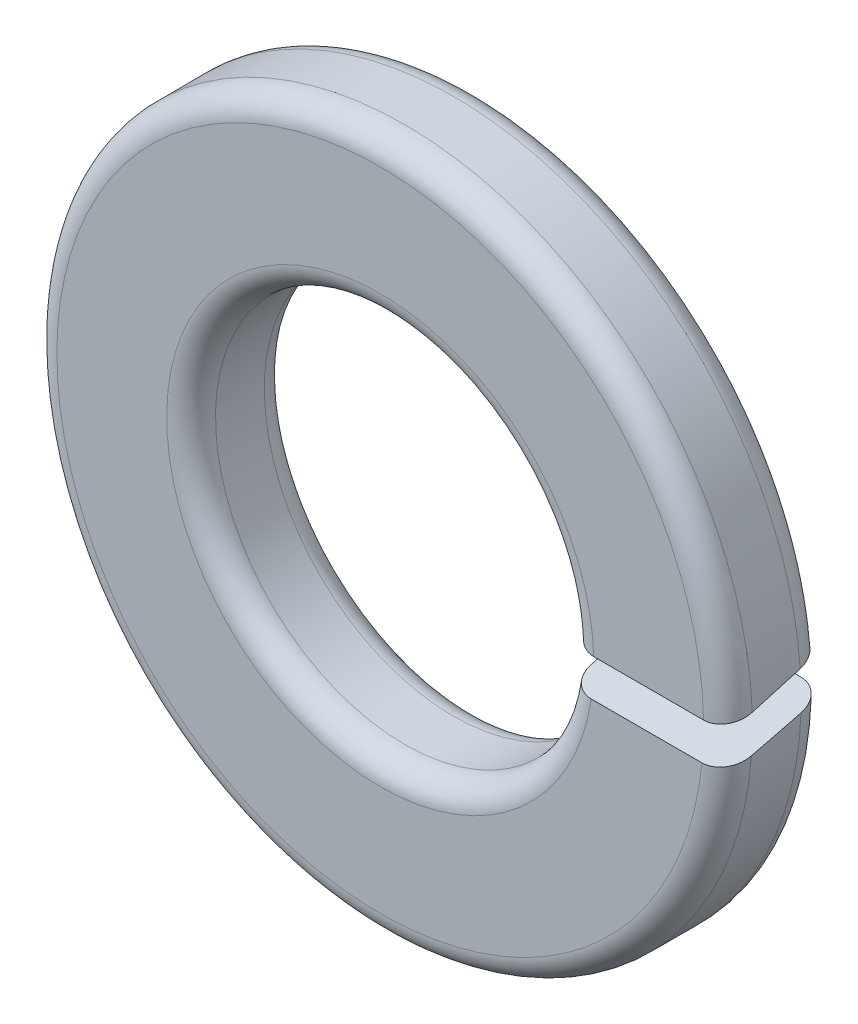
ISO-10303-21;
HEADER;
FILE_DESCRIPTION(('STEP AP214'),'2;1');
FILE_NAME('part.step','',(''),(''),'','','');
FILE_SCHEMA(('AUTOMOTIVE_DESIGN { 1 0 10303 214 1 1 1 1 }'));
ENDSEC;
DATA;
#1=APPLICATION_CONTEXT('core data for automotive mechanical design processes');
#2=APPLICATION_PROTOCOL_DEFINITION('international standard','automotive_design',2000,#1);
#3=PRODUCT_CONTEXT('',#1,'mechanical');
#4=PRODUCT('Part','Part','',(#3));
#5=PRODUCT_RELATED_PRODUCT_CATEGORY('part','',(#4));
#6=PRODUCT_DEFINITION_FORMATION('','',#4);
#7=PRODUCT_DEFINITION_CONTEXT('part definition',#1,'design');
#8=PRODUCT_DEFINITION('design','',#6,#7);
#9=PRODUCT_DEFINITION_SHAPE('','',#8);
#10=(LENGTH_UNIT() NAMED_UNIT(*) SI_UNIT(.MILLI.,.METRE.));
#11=(NAMED_UNIT(*) PLANE_ANGLE_UNIT() SI_UNIT($,.RADIAN.));
#12=(NAMED_UNIT(*) SI_UNIT($,.STERADIAN.) SOLID_ANGLE_UNIT());
#13=UNCERTAINTY_MEASURE_WITH_UNIT(LENGTH_MEASURE(1.E-05),#10,'distance_accuracy_value','');
#14=(GEOMETRIC_REPRESENTATION_CONTEXT(3) GLOBAL_UNCERTAINTY_ASSIGNED_CONTEXT((#13)) GLOBAL_UNIT_ASSIGNED_CONTEXT((#10,
#11,#12)) REPRESENTATION_CONTEXT('',''));
#15=CARTESIAN_POINT('',(0.,0.,0.));
#16=DIRECTION('',(0.,0.,1.));
#17=DIRECTION('',(1.,0.,0.));
#18=AXIS2_PLACEMENT_3D('',#15,#16,#17);
#19=CARTESIAN_POINT('',(0.,0.,0.8));
#20=DIRECTION('',(0.,0.,1.));
#21=DIRECTION('',(1.,0.,0.));
#22=AXIS2_PLACEMENT_3D('',#19,#20,#21);
#23=PLANE('',#22);
#24=CARTESIAN_POINT('',(0.,0.,0.8));
#25=DIRECTION('',(0.,0.,1.));
#26=DIRECTION('',(1.,0.,0.));
#27=AXIS2_PLACEMENT_3D('',#24,#25,#26);
#28=CIRCLE('',#27,1.75);
#29=CARTESIAN_POINT('',(1.73020487791106,-0.262471104033963,0.8));
#30=VERTEX_POINT('',#29);
#31=CARTESIAN_POINT('',(1.74933852055666,0.0481117500890618,0.8));
#32=VERTEX_POINT('',#31);
#33=EDGE_CURVE('E116',#30,#32,#28,.F.);
#34=ORIENTED_EDGE('',*,*,#33,.T.);
#35=DIRECTION('',(-1.,0.,0.));
#36=VECTOR('',#35,1.);
#37=CARTESIAN_POINT('',(2.85,0.0481117500890618,0.8));
#38=LINE('',#37,#36);
#39=CARTESIAN_POINT('',(2.64956322051454,0.0481117500890618,0.8));
#40=VERTEX_POINT('',#39);
#41=EDGE_CURVE('E199',#40,#32,#38,.T.);
#42=ORIENTED_EDGE('',*,*,#41,.F.);
#43=CARTESIAN_POINT('',(0.,0.,0.8));
#44=DIRECTION('',(0.,0.,1.));
#45=DIRECTION('',(1.,0.,0.));
#46=AXIS2_PLACEMENT_3D('',#43,#44,#45);
#47=CIRCLE('',#46,2.65);
#48=CARTESIAN_POINT('',(2.63696964706661,-0.262471104033963,0.8));
#49=VERTEX_POINT('',#48);
#50=EDGE_CURVE('E121',#40,#49,#47,.T.);
#51=ORIENTED_EDGE('',*,*,#50,.T.);
#52=DIRECTION('',(-1.,0.,0.));
#53=VECTOR('',#52,1.);
#54=CARTESIAN_POINT('',(2.85,-0.262471104033963,0.8));
#55=LINE('',#54,#53);
#56=EDGE_CURVE('E113',#49,#30,#55,.T.);
#57=ORIENTED_EDGE('',*,*,#56,.T.);
#58=EDGE_LOOP('',(#34,#42,#51,#57));
#59=FACE_BOUND('',#58,.T.);
#60=ADVANCED_FACE('F31',(#59),#23,.T.);
#61=CARTESIAN_POINT('',(0.,0.,0.));
#62=DIRECTION('',(0.,0.,1.));
#63=DIRECTION('',(1.,0.,0.));
#64=AXIS2_PLACEMENT_3D('',#61,#62,#63);
#65=PLANE('',#64);
#66=DIRECTION('',(-1.,0.,0.));
#67=VECTOR('',#66,1.);
#68=CARTESIAN_POINT('',(2.85,0.262471104033963,0.));
#69=LINE('',#68,#67);
#70=CARTESIAN_POINT('',(2.63696964706597,0.262471104033963,0.));
#71=VERTEX_POINT('',#70);
#72=CARTESIAN_POINT('',(1.73020487791106,0.262471104033963,0.));
#73=VERTEX_POINT('',#72);
#74=EDGE_CURVE('E59',#71,#73,#69,.T.);
#75=ORIENTED_EDGE('',*,*,#74,.T.);
#76=CARTESIAN_POINT('',(0.,0.,0.));
#77=DIRECTION('',(0.,0.,1.));
#78=DIRECTION('',(1.,0.,0.));
#79=AXIS2_PLACEMENT_3D('',#76,#77,#78);
#80=CIRCLE('',#79,1.75);
#81=CARTESIAN_POINT('',(1.74933852055671,-0.048111750089062,0.));
#82=VERTEX_POINT('',#81);
#83=EDGE_CURVE('E112',#73,#82,#80,.T.);
#84=ORIENTED_EDGE('',*,*,#83,.T.);
#85=DIRECTION('',(-1.,0.,0.));
#86=VECTOR('',#85,1.);
#87=CARTESIAN_POINT('',(2.85,-0.048111750089062,0.));
#88=LINE('',#87,#86);
#89=CARTESIAN_POINT('',(2.64956322051454,-0.048111750089062,0.));
#90=VERTEX_POINT('',#89);
#91=EDGE_CURVE('E99',#90,#82,#88,.T.);
#92=ORIENTED_EDGE('',*,*,#91,.F.);
#93=CARTESIAN_POINT('',(0.,0.,0.));
#94=DIRECTION('',(0.,0.,1.));
#95=DIRECTION('',(1.,0.,0.));
#96=AXIS2_PLACEMENT_3D('',#93,#94,#95);
#97=CIRCLE('',#96,2.65);
#98=EDGE_CURVE('E110',#90,#71,#97,.F.);
#99=ORIENTED_EDGE('',*,*,#98,.T.);
#100=EDGE_LOOP('',(#75,#84,#92,#99));
#101=FACE_BOUND('',#100,.T.);
#102=ADVANCED_FACE('F109',(#101),#65,.F.);
#103=CARTESIAN_POINT('',(0.,0.,0.8));
#104=DIRECTION('',(0.,0.,-1.));
#105=DIRECTION('',(-1.,0.,0.));
#106=AXIS2_PLACEMENT_3D('',#103,#104,#105);
#107=CYLINDRICAL_SURFACE('',#106,2.85);
#108=CARTESIAN_POINT('',(0.,0.,0.979555495773432));
#109=DIRECTION('',(0.,-0.965925826289067,-0.258819045102525));
#110=DIRECTION('',(0.,0.258819045102525,-0.965925826289067));
#111=AXIS2_PLACEMENT_3D('',#108,#109,#110);
#112=ELLIPSE('',#111,11.0115544196952,2.85);
#113=CARTESIAN_POINT('',(2.84233506415116,0.208881265547738,0.200000000000001));
#114=VERTEX_POINT('',#113);
#115=CARTESIAN_POINT('',(2.84818482316041,0.101701588575287,0.6));
#116=VERTEX_POINT('',#115);
#117=EDGE_CURVE('E215',#114,#116,#112,.T.);
#118=ORIENTED_EDGE('',*,*,#117,.F.);
#119=CARTESIAN_POINT('',(0.,0.,0.2));
#120=DIRECTION('',(0.,0.,1.));
#121=DIRECTION('',(1.,0.,0.));
#122=AXIS2_PLACEMENT_3D('',#119,#120,#121);
#123=CIRCLE('',#122,2.85);
#124=CARTESIAN_POINT('',(2.84818482316041,-0.101701588575287,0.2));
#125=VERTEX_POINT('',#124);
#126=EDGE_CURVE('E118',#114,#125,#123,.T.);
#127=ORIENTED_EDGE('',*,*,#126,.T.);
#128=CARTESIAN_POINT('',(0.,0.,-0.179555495773433));
#129=DIRECTION('',(0.,0.965925826289067,0.258819045102525));
#130=DIRECTION('',(0.,0.258819045102525,-0.965925826289067));
#131=AXIS2_PLACEMENT_3D('',#128,#129,#130);
#132=ELLIPSE('',#131,11.0115544196952,2.85);
#133=CARTESIAN_POINT('',(2.84233506415116,-0.208881265547738,0.6));
#134=VERTEX_POINT('',#133);
#135=EDGE_CURVE('E51',#134,#125,#132,.T.);
#136=ORIENTED_EDGE('',*,*,#135,.F.);
#137=CARTESIAN_POINT('',(0.,0.,0.6));
#138=DIRECTION('',(0.,0.,1.));
#139=DIRECTION('',(1.,0.,0.));
#140=AXIS2_PLACEMENT_3D('',#137,#138,#139);
#141=CIRCLE('',#140,2.85);
#142=EDGE_CURVE('E105',#134,#116,#141,.F.);
#143=ORIENTED_EDGE('',*,*,#142,.T.);
#144=EDGE_LOOP('',(#118,#127,#136,#143));
#145=FACE_BOUND('',#144,.T.);
#146=ADVANCED_FACE('F33',(#145),#107,.T.);
#147=CARTESIAN_POINT('',(0.,0.,0.8));
#148=DIRECTION('',(0.,0.,-1.));
#149=DIRECTION('',(-1.,0.,0.));
#150=AXIS2_PLACEMENT_3D('',#147,#148,#149);
#151=CYLINDRICAL_SURFACE('',#150,1.55);
#152=CARTESIAN_POINT('',(0.,0.,0.2));
#153=DIRECTION('',(0.,0.,1.));
#154=DIRECTION('',(1.,0.,0.));
#155=AXIS2_PLACEMENT_3D('',#152,#153,#154);
#156=CIRCLE('',#155,1.55);
#157=CARTESIAN_POINT('',(1.54665988080161,-0.101701588575288,0.200000000000001));
#158=VERTEX_POINT('',#157);
#159=CARTESIAN_POINT('',(1.53586087159716,0.208881265547739,0.199999999999998));
#160=VERTEX_POINT('',#159);
#161=EDGE_CURVE('E188',#158,#160,#156,.F.);
#162=ORIENTED_EDGE('',*,*,#161,.T.);
#163=CARTESIAN_POINT('',(0.,0.,0.979555495773432));
#164=DIRECTION('',(0.,-0.965925826289067,-0.258819045102525));
#165=DIRECTION('',(0.,0.258819045102525,-0.965925826289067));
#166=AXIS2_PLACEMENT_3D('',#163,#164,#165);
#167=ELLIPSE('',#166,5.98874012299213,1.55);
#168=CARTESIAN_POINT('',(1.54665988080161,0.101701588575287,0.6));
#169=VERTEX_POINT('',#168);
#170=EDGE_CURVE('E174',#160,#169,#167,.T.);
#171=ORIENTED_EDGE('',*,*,#170,.T.);
#172=CARTESIAN_POINT('',(0.,0.,0.6));
#173=DIRECTION('',(0.,0.,1.));
#174=DIRECTION('',(1.,0.,0.));
#175=AXIS2_PLACEMENT_3D('',#172,#173,#174);
#176=CIRCLE('',#175,1.55);
#177=CARTESIAN_POINT('',(1.53586087159716,-0.208881265547738,0.6));
#178=VERTEX_POINT('',#177);
#179=EDGE_CURVE('E191',#169,#178,#176,.T.);
#180=ORIENTED_EDGE('',*,*,#179,.T.);
#181=CARTESIAN_POINT('',(0.,0.,-0.179555495773433));
#182=DIRECTION('',(0.,0.965925826289067,0.258819045102525));
#183=DIRECTION('',(0.,0.258819045102525,-0.965925826289067));
#184=AXIS2_PLACEMENT_3D('',#181,#182,#183);
#185=ELLIPSE('',#184,5.98874012299213,1.55);
#186=EDGE_CURVE('E154',#178,#158,#185,.T.);
#187=ORIENTED_EDGE('',*,*,#186,.T.);
#188=EDGE_LOOP('',(#162,#171,#180,#187));
#189=FACE_BOUND('',#188,.T.);
#190=ADVANCED_FACE('F213',(#189),#151,.F.);
#191=CARTESIAN_POINT('',(0.,0.,0.6));
#192=DIRECTION('',(0.,0.,1.));
#193=DIRECTION('',(1.,0.,0.));
#194=AXIS2_PLACEMENT_3D('',#191,#192,#193);
#195=TOROIDAL_SURFACE('',#194,1.75,0.2);
#196=ORIENTED_EDGE('',*,*,#179,.F.);
#197=CARTESIAN_POINT('',(1.54665645625202,0.101755178413774,0.5998));
#198=CARTESIAN_POINT('',(1.54684499566643,0.0986061826476783,0.611552212191886));
#199=CARTESIAN_POINT('',(1.54807492349918,0.0954622493659219,0.623285530935008));
#200=CARTESIAN_POINT('',(1.55254223075983,0.0892709113297575,0.646391919052807));
#201=CARTESIAN_POINT('',(1.55577986364626,0.0862235188139993,0.657764942752221));
#202=CARTESIAN_POINT('',(1.56418946852833,0.0803108889003449,0.67983117799633));
#203=CARTESIAN_POINT('',(1.56936249723886,0.0774457520146896,0.690524014424235));
#204=CARTESIAN_POINT('',(1.58151352875446,0.0719853183279291,0.710902630374586));
#205=CARTESIAN_POINT('',(1.58849084802892,0.0693899198609996,0.720588789319053));
#206=CARTESIAN_POINT('',(1.60398127948817,0.0645803412919593,0.738538380901706));
#207=CARTESIAN_POINT('',(1.61247444093145,0.0623618639528783,0.746817851046596));
#208=CARTESIAN_POINT('',(1.63083231324646,0.0583425153475336,0.761818264255073));
#209=CARTESIAN_POINT('',(1.64069715004196,0.0565416824627778,0.768539064076923));
#210=CARTESIAN_POINT('',(1.66111730525023,0.0534837049987454,0.779951591341092));
#211=CARTESIAN_POINT('',(1.67163258919453,0.0522086278487169,0.784710244048568));
#212=CARTESIAN_POINT('',(1.69335806399738,0.0501558961195537,0.792371143156114));
#213=CARTESIAN_POINT('',(1.7045673148634,0.0493775841609281,0.795275842929843));
#214=CARTESIAN_POINT('',(1.72160018160645,0.048606449508953,0.798153756630491));
#215=CARTESIAN_POINT('',(1.72729917371314,0.0484154468203551,0.798866588368721));
#216=CARTESIAN_POINT('',(1.73873148323704,0.0481651295275354,0.799800785223537));
#217=CARTESIAN_POINT('',(1.74446473585614,0.0481056165795094,0.800022890569278));
#218=CARTESIAN_POINT('',(1.75019999999999,0.048112246875637,0.799998145967261));
#219=B_SPLINE_CURVE_WITH_KNOTS('',3,(#197,#198,#199,#200,#201,#202,#203,#204,#205,#206,#207,
#208,#209,#210,#211,#212,#213,#214,#215,#216,#217,#218),.UNSPECIFIED.,.F.,.F.,(4,2,2,2,2,2,2,2,
2,2,4),(0.,0.0364573751008911,0.07291935362416,0.109401269298186,0.145869384496923,
0.181888837435626,0.217911599250003,0.252576742057746,0.28719591614266,0.304416014983086,
0.321610120628355),.UNSPECIFIED.);
#220=EDGE_CURVE('E182',#169,#32,#219,.T.);
#221=ORIENTED_EDGE('',*,*,#220,.T.);
#222=ORIENTED_EDGE('',*,*,#33,.F.);
#223=CARTESIAN_POINT('',(1.7502,-0.262209630622204,0.799024167942485));
#224=CARTESIAN_POINT('',(1.73930912738885,-0.262497359867144,0.800097988103423));
#225=CARTESIAN_POINT('',(1.72832277992004,-0.262548348695288,0.800288281000677));
#226=CARTESIAN_POINT('',(1.70646825563088,-0.262178245406867,0.79890703672424));
#227=CARTESIAN_POINT('',(1.69560009610959,-0.261757085096831,0.797335245049057));
#228=CARTESIAN_POINT('',(1.67428105541743,-0.260443179044081,0.792431680903819));
#229=CARTESIAN_POINT('',(1.66383071376601,-0.259549843482496,0.789097707199778));
#230=CARTESIAN_POINT('',(1.64368031636129,-0.257314142736716,0.780753958426006));
#231=CARTESIAN_POINT('',(1.63397981733064,-0.255972045381131,0.77574518290626));
#232=CARTESIAN_POINT('',(1.61576737971209,-0.252903383987461,0.764292782673857));
#233=CARTESIAN_POINT('',(1.60723815410089,-0.251183686232782,0.757874783279733));
#234=CARTESIAN_POINT('',(1.59141384482392,-0.247398438190675,0.74374804526734));
#235=CARTESIAN_POINT('',(1.58411893507146,-0.245332839247718,0.736039125064166));
#236=CARTESIAN_POINT('',(1.57093813553797,-0.240914037899366,0.719547933923559));
#237=CARTESIAN_POINT('',(1.56505491897963,-0.238560302395835,0.710763673436806));
#238=CARTESIAN_POINT('',(1.55484164516691,-0.233636116411414,0.692386361157026));
#239=CARTESIAN_POINT('',(1.55051235615359,-0.231065559510338,0.682792912198467));
#240=CARTESIAN_POINT('',(1.54336519692944,-0.225690888080951,0.662734365350005));
#241=CARTESIAN_POINT('',(1.54060316484177,-0.222881822465327,0.652250789750699));
#242=CARTESIAN_POINT('',(1.53685213300574,-0.217189679781391,0.631007424050321));
#243=CARTESIAN_POINT('',(1.53586011742553,-0.214306737108492,0.620248135519755));
#244=CARTESIAN_POINT('',(1.53570431282245,-0.210558415561585,0.606259209063591));
#245=CARTESIAN_POINT('',(1.53574705069404,-0.209692476550421,0.603027480677671));
#246=CARTESIAN_POINT('',(1.5358682599292,-0.208827675709252,0.5998));
#247=B_SPLINE_CURVE_WITH_KNOTS('',3,(#223,#224,#225,#226,#227,#228,#229,#230,#231,#232,#233,
#234,#235,#236,#237,#238,#239,#240,#241,#242,#243,#244,#245,#246),.UNSPECIFIED.,.F.,.F.,(4,2,2,
2,2,2,2,2,2,2,2,4),(0.,0.0328090665009481,0.0656228722932912,0.0984777647417578,0.1313130837309,
0.163594595146905,0.195880651200048,0.22822737091997,0.260590060471673,0.294043131792411,
0.327439149674152,0.337472976972827),.UNSPECIFIED.);
#248=EDGE_CURVE('E210',#30,#178,#247,.T.);
#249=ORIENTED_EDGE('',*,*,#248,.T.);
#250=EDGE_LOOP('',(#196,#221,#222,#249));
#251=FACE_BOUND('',#250,.T.);
#252=ADVANCED_FACE('F160',(#251),#195,.T.);
#253=CARTESIAN_POINT('',(0.,0.,0.2));
#254=DIRECTION('',(0.,0.,1.));
#255=DIRECTION('',(1.,0.,0.));
#256=AXIS2_PLACEMENT_3D('',#253,#254,#255);
#257=TOROIDAL_SURFACE('',#256,1.75,0.2);
#258=ORIENTED_EDGE('',*,*,#83,.F.);
#259=CARTESIAN_POINT('',(1.7502,0.262209630622204,0.000975832057514856));
#260=CARTESIAN_POINT('',(1.73930912738885,0.262497359867144,-9.79881034228843E-05));
#261=CARTESIAN_POINT('',(1.72832277992004,0.262548348695288,-0.000288281000676921));
#262=CARTESIAN_POINT('',(1.70646825563088,0.262178245406867,0.0010929632757601));
#263=CARTESIAN_POINT('',(1.69560009610959,0.261757085096831,0.00266475495094293));
#264=CARTESIAN_POINT('',(1.67428105541743,0.260443179044081,0.00756831909618054));
#265=CARTESIAN_POINT('',(1.66383071376601,0.259549843482496,0.010902292800222));
#266=CARTESIAN_POINT('',(1.64368031636129,0.257314142736716,0.0192460415739943));
#267=CARTESIAN_POINT('',(1.63397981733064,0.255972045381131,0.0242548170937396));
#268=CARTESIAN_POINT('',(1.61576737971209,0.252903383987461,0.035707217326143));
#269=CARTESIAN_POINT('',(1.60723815410089,0.251183686232782,0.0421252167202671));
#270=CARTESIAN_POINT('',(1.59141384482392,0.247398438190675,0.0562519547326605));
#271=CARTESIAN_POINT('',(1.58411893507146,0.245332839247718,0.0639608749358344));
#272=CARTESIAN_POINT('',(1.57093813553797,0.240914037899365,0.0804520660764407));
#273=CARTESIAN_POINT('',(1.56505491897963,0.238560302395835,0.0892363265631942));
#274=CARTESIAN_POINT('',(1.55484164516691,0.233636116411414,0.107613638842974));
#275=CARTESIAN_POINT('',(1.55051235615359,0.231065559510338,0.117207087801533));
#276=CARTESIAN_POINT('',(1.54336519692944,0.225690888080951,0.137265634649996));
#277=CARTESIAN_POINT('',(1.54060316484177,0.222881822465327,0.147749210249301));
#278=CARTESIAN_POINT('',(1.53685213300574,0.217189679781391,0.168992575949679));
#279=CARTESIAN_POINT('',(1.53586011742553,0.214306737108492,0.179751864480245));
#280=CARTESIAN_POINT('',(1.53570431282245,0.210558415561585,0.193740790936409));
#281=CARTESIAN_POINT('',(1.53574705069404,0.209692476550421,0.196972519322329));
#282=CARTESIAN_POINT('',(1.5358682599292,0.208827675709252,0.2002));
#283=B_SPLINE_CURVE_WITH_KNOTS('',3,(#259,#260,#261,#262,#263,#264,#265,#266,#267,#268,#269,
#270,#271,#272,#273,#274,#275,#276,#277,#278,#279,#280,#281,#282),.UNSPECIFIED.,.F.,.F.,(4,2,2,
2,2,2,2,2,2,2,2,4),(0.,0.0328090665009481,0.0656228722932912,0.0984777647417578,0.1313130837309,
0.163594595146905,0.195880651200048,0.22822737091997,0.260590060471673,0.294043131792411,
0.327439149674152,0.337472976972827),.UNSPECIFIED.);
#284=EDGE_CURVE('E167',#73,#160,#283,.T.);
#285=ORIENTED_EDGE('',*,*,#284,.T.);
#286=ORIENTED_EDGE('',*,*,#161,.F.);
#287=CARTESIAN_POINT('',(1.54665645625202,-0.101755178413774,0.2002));
#288=CARTESIAN_POINT('',(1.54684499566643,-0.0986061826476785,0.188447787808114));
#289=CARTESIAN_POINT('',(1.54807492349918,-0.0954622493659221,0.176714469064992));
#290=CARTESIAN_POINT('',(1.55254223075982,-0.0892709113297577,0.153608080947193));
#291=CARTESIAN_POINT('',(1.55577986364626,-0.0862235188139995,0.142235057247779));
#292=CARTESIAN_POINT('',(1.56418946852833,-0.0803108889003451,0.12016882200367));
#293=CARTESIAN_POINT('',(1.56936249723886,-0.0774457520146899,0.109475985575765));
#294=CARTESIAN_POINT('',(1.58151352875446,-0.0719853183279293,0.089097369625414));
#295=CARTESIAN_POINT('',(1.58849084802892,-0.0693899198609998,0.0794112106809468));
#296=CARTESIAN_POINT('',(1.60398127948817,-0.0645803412919595,0.0614616190982943));
#297=CARTESIAN_POINT('',(1.61247444093145,-0.0623618639528785,0.053182148953404));
#298=CARTESIAN_POINT('',(1.63083231324646,-0.0583425153475339,0.0381817357449269));
#299=CARTESIAN_POINT('',(1.64069715004196,-0.056541682462778,0.0314609359230774));
#300=CARTESIAN_POINT('',(1.66111730525023,-0.0534837049987457,0.0200484086589082));
#301=CARTESIAN_POINT('',(1.67163258919453,-0.0522086278487172,0.0152897559514317));
#302=CARTESIAN_POINT('',(1.69335806399738,-0.0501558961195539,0.00762885684388569));
#303=CARTESIAN_POINT('',(1.7045673148634,-0.0493775841609283,0.00472415707015659));
#304=CARTESIAN_POINT('',(1.72160018160645,-0.0486064495089533,0.0018462433695089));
#305=CARTESIAN_POINT('',(1.72729917371314,-0.0484154468203553,0.00113341163127916));
#306=CARTESIAN_POINT('',(1.73873148323704,-0.0481651295275356,0.000199214776463041));
#307=CARTESIAN_POINT('',(1.74446473585614,-0.0481056165795097,-2.28905692781266E-05));
#308=CARTESIAN_POINT('',(1.75019999999999,-0.0481122468756372,1.85403273901141E-06));
#309=B_SPLINE_CURVE_WITH_KNOTS('',3,(#287,#288,#289,#290,#291,#292,#293,#294,#295,#296,#297,
#298,#299,#300,#301,#302,#303,#304,#305,#306,#307,#308),.UNSPECIFIED.,.F.,.F.,(4,2,2,2,2,2,2,2,
2,2,4),(0.,0.036457375100891,0.0729193536241599,0.109401269298186,0.145869384496923,
0.181888837435626,0.217911599250003,0.252576742057746,0.28719591614266,0.304416014983086,
0.321610120628355),.UNSPECIFIED.);
#310=EDGE_CURVE('E148',#158,#82,#309,.T.);
#311=ORIENTED_EDGE('',*,*,#310,.T.);
#312=EDGE_LOOP('',(#258,#285,#286,#311));
#313=FACE_BOUND('',#312,.T.);
#314=ADVANCED_FACE('F155',(#313),#257,.T.);
#315=CARTESIAN_POINT('',(0.,0.,0.6));
#316=DIRECTION('',(0.,0.,1.));
#317=DIRECTION('',(1.,0.,0.));
#318=AXIS2_PLACEMENT_3D('',#315,#316,#317);
#319=TOROIDAL_SURFACE('',#318,2.65,0.2);
#320=ORIENTED_EDGE('',*,*,#50,.F.);
#321=CARTESIAN_POINT('',(2.44788610308285,0.101755178413773,0.5998));
#322=CARTESIAN_POINT('',(2.44799710646355,0.0986262733096464,0.611477232820663));
#323=CARTESIAN_POINT('',(2.4491398621911,0.0955004657682211,0.623142905379945));
#324=CARTESIAN_POINT('',(2.45342099939149,0.0893409667886329,0.646130468520936));
#325=CARTESIAN_POINT('',(2.45655984391043,0.0863072968953915,0.657452278695905));
#326=CARTESIAN_POINT('',(2.46476778098678,0.0804176496039478,0.679432741626233));
#327=CARTESIAN_POINT('',(2.46983810312454,0.0775617867480465,0.690090966903905));
#328=CARTESIAN_POINT('',(2.48178255046155,0.0721160159491853,0.710414860211629));
#329=CARTESIAN_POINT('',(2.48865592157826,0.0695259974516677,0.720080940836908));
#330=CARTESIAN_POINT('',(2.50392609390901,0.064727297385739,0.737989933293238));
#331=CARTESIAN_POINT('',(2.51230006891167,0.0625137575956651,0.746250976254369));
#332=CARTESIAN_POINT('',(2.53041386829479,0.0584982805986888,0.761236940423708));
#333=CARTESIAN_POINT('',(2.54015364089157,0.0566963277934316,0.767961919845769));
#334=CARTESIAN_POINT('',(2.56034363470766,0.0536264406894453,0.779418894491347));
#335=CARTESIAN_POINT('',(2.5707552426637,0.0523414987851043,0.784214362963121));
#336=CARTESIAN_POINT('',(2.59228433150369,0.0502614729777455,0.791977124957239));
#337=CARTESIAN_POINT('',(2.60340160941541,0.0494662489148863,0.79494494156323));
#338=CARTESIAN_POINT('',(2.6256004814922,0.0484150476208592,0.798868078201522));
#339=CARTESIAN_POINT('',(2.63666924733837,0.0481408752494761,0.799891303421555));
#340=CARTESIAN_POINT('',(2.65882447712111,0.0480870433963813,0.80009220663237));
#341=CARTESIAN_POINT('',(2.66991093899418,0.0483073299448697,0.799270086041188));
#342=CARTESIAN_POINT('',(2.69157619827214,0.0492272614203247,0.795836855035308));
#343=CARTESIAN_POINT('',(2.70216054591738,0.0499181871710368,0.793258285029393));
#344=CARTESIAN_POINT('',(2.72273367720905,0.051748034994134,0.786429199983475));
#345=CARTESIAN_POINT('',(2.73272246164947,0.052886956469252,0.782178687172503));
#346=CARTESIAN_POINT('',(2.75188059065676,0.0555832979228676,0.772115803873056));
#347=CARTESIAN_POINT('',(2.76104565721626,0.0571427513731559,0.766295844364542));
#348=CARTESIAN_POINT('',(2.77826237292203,0.0606294031505501,0.753283482783006));
#349=CARTESIAN_POINT('',(2.78631397786597,0.0625566160697929,0.746091026251389));
#350=CARTESIAN_POINT('',(2.80127476502411,0.066769480648908,0.730368401596725));
#351=CARTESIAN_POINT('',(2.80815400962195,0.0690622498382631,0.721811670492023));
#352=CARTESIAN_POINT('',(2.82038128714742,0.0739076268432975,0.703728477327409));
#353=CARTESIAN_POINT('',(2.82572860845934,0.0764603546722203,0.694201567371974));
#354=CARTESIAN_POINT('',(2.83491110338187,0.0818364662327762,0.674137645880821));
#355=CARTESIAN_POINT('',(2.83869442619952,0.0846657770716926,0.663578514079581));
#356=CARTESIAN_POINT('',(2.844418475364,0.0904428671911229,0.642018120233963));
#357=CARTESIAN_POINT('',(2.8463616964122,0.0933904804128562,0.631017477929392));
#358=CARTESIAN_POINT('',(2.8479851099204,0.0981527608287269,0.613244405457473));
#359=CARTESIAN_POINT('',(2.84825606743082,0.0999549420417352,0.60651857360608));
#360=CARTESIAN_POINT('',(2.84818280903208,0.101755178413773,0.5998));
#361=B_SPLINE_CURVE_WITH_KNOTS('',3,(#321,#322,#323,#324,#325,#326,#327,#328,#329,#330,#331,
#332,#333,#334,#335,#336,#337,#338,#339,#340,#341,#342,#343,#344,#345,#346,#347,#348,#349,#350,
#351,#352,#353,#354,#355,#356,#357,#358,#359,#360),.UNSPECIFIED.,.F.,.F.,(4,2,2,2,2,2,2,2,2,2,2,
2,2,2,2,2,2,2,2,4),(0.,0.0362235715990288,0.072455549289601,0.108710630939114,0.144950573866929,
0.180679969360934,0.216408010554848,0.250839376476575,0.285260883373474,0.318456571797341,
0.351648637114272,0.384241927061076,0.416835173554713,0.449588941140234,0.482344008615832,
0.515839480320776,0.549350486353029,0.583897341704271,0.618397293127013,0.639266927690398),.UNSPECIFIED.);
#362=EDGE_CURVE('E175',#40,#116,#361,.T.);
#363=ORIENTED_EDGE('',*,*,#362,.T.);
#364=ORIENTED_EDGE('',*,*,#142,.F.);
#365=CARTESIAN_POINT('',(2.84233890165437,-0.208827675709252,0.5998));
#366=CARTESIAN_POINT('',(2.84212981514327,-0.211944664437214,0.611432760299375));
#367=CARTESIAN_POINT('',(2.84088242938026,-0.215055682670788,0.623043238410347));
#368=CARTESIAN_POINT('',(2.83639714247563,-0.221178628757664,0.645894384298573));
#369=CARTESIAN_POINT('',(2.83316022860503,-0.224190604978456,0.657135232585757));
#370=CARTESIAN_POINT('',(2.82478026244321,-0.230032505499935,0.678937502144679));
#371=CARTESIAN_POINT('',(2.81963660538755,-0.232862371705967,0.689498706604211));
#372=CARTESIAN_POINT('',(2.80758550676269,-0.238257749776412,0.709634531689156));
#373=CARTESIAN_POINT('',(2.80067838336339,-0.240823309210779,0.719209329848051));
#374=CARTESIAN_POINT('',(2.78529599152874,-0.245610060468491,0.737073728745025));
#375=CARTESIAN_POINT('',(2.77682353405376,-0.247831856669707,0.745365585052026));
#376=CARTESIAN_POINT('',(2.75852928818378,-0.251866720819121,0.760423903059279));
#377=CARTESIAN_POINT('',(2.74870743767098,-0.25367976994095,0.767190294498562));
#378=CARTESIAN_POINT('',(2.72821011210195,-0.256801395961249,0.778840361408545));
#379=CARTESIAN_POINT('',(2.71755703646917,-0.258119815151344,0.783760768811655));
#380=CARTESIAN_POINT('',(2.6955269227543,-0.260256796989629,0.791736093606986));
#381=CARTESIAN_POINT('',(2.68415006438061,-0.261075483186059,0.794791472087518));
#382=CARTESIAN_POINT('',(2.66140534793698,-0.262159910286501,0.798838609123472));
#383=CARTESIAN_POINT('',(2.65005008496262,-0.26244334109795,0.799896387312229));
#384=CARTESIAN_POINT('',(2.6273218813799,-0.262494959848663,0.800089031112514));
#385=CARTESIAN_POINT('',(2.61594894469041,-0.262263249179323,0.799224275121882));
#386=CARTESIAN_POINT('',(2.59390206997499,-0.261302239864523,0.7956377395325));
#387=CARTESIAN_POINT('',(2.58321742654578,-0.260589349754191,0.792977197420529));
#388=CARTESIAN_POINT('',(2.56247629805537,-0.258701704338777,0.78593240882353));
#389=CARTESIAN_POINT('',(2.55241973523812,-0.257527006337143,0.781548376197883));
#390=CARTESIAN_POINT('',(2.5333800603146,-0.254773282175114,0.771271337715159));
#391=CARTESIAN_POINT('',(2.52438250378514,-0.2532009343932,0.765403255905887));
#392=CARTESIAN_POINT('',(2.5075239890108,-0.249691140936687,0.752304528402108));
#393=CARTESIAN_POINT('',(2.49966299392537,-0.247753707100689,0.745073926889862));
#394=CARTESIAN_POINT('',(2.48520485819677,-0.243551508232243,0.729391107209313));
#395=CARTESIAN_POINT('',(2.47862076344174,-0.241283740798247,0.72092768392589));
#396=CARTESIAN_POINT('',(2.46696108753429,-0.236501119636743,0.703078698757805));
#397=CARTESIAN_POINT('',(2.4618861564148,-0.233986160056399,0.693692741824979));
#398=CARTESIAN_POINT('',(2.45320428895679,-0.228692834990015,0.673937783736256));
#399=CARTESIAN_POINT('',(2.44965194129761,-0.225908482821323,0.663546439976534));
#400=CARTESIAN_POINT('',(2.44432958251684,-0.220231374899083,0.642359184770682));
#401=CARTESIAN_POINT('',(2.44255752231655,-0.217338747756623,0.631563753307666));
#402=CARTESIAN_POINT('',(2.44111317350073,-0.212565597770454,0.613750115047137));
#403=CARTESIAN_POINT('',(2.4409151257,-0.210694954587239,0.606768779644549));
#404=CARTESIAN_POINT('',(2.44108408127578,-0.208827675709252,0.5998));
#405=B_SPLINE_CURVE_WITH_KNOTS('',3,(#365,#366,#367,#368,#369,#370,#371,#372,#373,#374,#375,
#376,#377,#378,#379,#380,#381,#382,#383,#384,#385,#386,#387,#388,#389,#390,#391,#392,#393,#394,
#395,#396,#397,#398,#399,#400,#401,#402,#403,#404),.UNSPECIFIED.,.F.,.F.,(4,2,2,2,2,2,2,2,2,2,2,
2,2,2,2,2,2,2,2,4),(0.,0.0360848868437009,0.0721518815891867,0.108230325555634,
0.144302264734924,0.180310046193696,0.216319485786357,0.251568695770401,0.286809187611636,
0.320863106712763,0.354910323832347,0.387851525658378,0.420788641263763,0.453205593534134,
0.485621494804792,0.518352902574015,0.551098388192127,0.584935692869697,0.618734006647921,
0.640385395181868),.UNSPECIFIED.);
#406=EDGE_CURVE('E142',#134,#49,#405,.T.);
#407=ORIENTED_EDGE('',*,*,#406,.T.);
#408=EDGE_LOOP('',(#320,#363,#364,#407));
#409=FACE_BOUND('',#408,.T.);
#410=ADVANCED_FACE('F159',(#409),#319,.T.);
#411=CARTESIAN_POINT('',(0.,0.,0.2));
#412=DIRECTION('',(0.,0.,1.));
#413=DIRECTION('',(1.,0.,0.));
#414=AXIS2_PLACEMENT_3D('',#411,#412,#413);
#415=TOROIDAL_SURFACE('',#414,2.65,0.2);
#416=ORIENTED_EDGE('',*,*,#126,.F.);
#417=CARTESIAN_POINT('',(2.84233890165437,0.208827675709252,0.2002));
#418=CARTESIAN_POINT('',(2.84212981514327,0.211944664437214,0.188567239700626));
#419=CARTESIAN_POINT('',(2.84088242938026,0.215055682670788,0.176956761589653));
#420=CARTESIAN_POINT('',(2.83639714247563,0.221178628757664,0.154105615701427));
#421=CARTESIAN_POINT('',(2.83316022860503,0.224190604978456,0.142864767414243));
#422=CARTESIAN_POINT('',(2.82478026244321,0.230032505499935,0.121062497855321));
#423=CARTESIAN_POINT('',(2.81963660538755,0.232862371705967,0.110501293395789));
#424=CARTESIAN_POINT('',(2.80758550676269,0.238257749776412,0.0903654683108438));
#425=CARTESIAN_POINT('',(2.80067838336339,0.240823309210779,0.0807906701519487));
#426=CARTESIAN_POINT('',(2.78529599152874,0.245610060468491,0.0629262712549752));
#427=CARTESIAN_POINT('',(2.77682353405376,0.247831856669707,0.0546344149479738));
#428=CARTESIAN_POINT('',(2.75852928818378,0.251866720819121,0.0395760969407205));
#429=CARTESIAN_POINT('',(2.74870743767098,0.25367976994095,0.0328097055014377));
#430=CARTESIAN_POINT('',(2.72821011210195,0.256801395961249,0.0211596385914553));
#431=CARTESIAN_POINT('',(2.71755703646917,0.258119815151344,0.0162392311883451));
#432=CARTESIAN_POINT('',(2.6955269227543,0.260256796989629,0.00826390639301435));
#433=CARTESIAN_POINT('',(2.68415006438061,0.261075483186059,0.00520852791248239));
#434=CARTESIAN_POINT('',(2.66140534793698,0.262159910286501,0.00116139087652768));
#435=CARTESIAN_POINT('',(2.65005008496262,0.26244334109795,0.000103612687771285));
#436=CARTESIAN_POINT('',(2.6273218813799,0.262494959848663,-8.90311125135924E-05));
#437=CARTESIAN_POINT('',(2.61594894469041,0.262263249179323,0.000775724878118498));
#438=CARTESIAN_POINT('',(2.59390206997499,0.261302239864523,0.00436226046749962));
#439=CARTESIAN_POINT('',(2.58321742654578,0.260589349754191,0.00702280257947153));
#440=CARTESIAN_POINT('',(2.56247629805537,0.258701704338777,0.01406759117647));
#441=CARTESIAN_POINT('',(2.55241973523812,0.257527006337143,0.0184516238021175));
#442=CARTESIAN_POINT('',(2.5333800603146,0.254773282175114,0.0287286622848411));
#443=CARTESIAN_POINT('',(2.52438250378514,0.253200934393199,0.0345967440941135));
#444=CARTESIAN_POINT('',(2.5075239890108,0.249691140936687,0.047695471597892));
#445=CARTESIAN_POINT('',(2.49966299392537,0.247753707100689,0.0549260731101384));
#446=CARTESIAN_POINT('',(2.48520485819677,0.243551508232243,0.0706088927906871));
#447=CARTESIAN_POINT('',(2.47862076344174,0.241283740798247,0.0790723160741109));
#448=CARTESIAN_POINT('',(2.46696108753429,0.236501119636743,0.0969213012421952));
#449=CARTESIAN_POINT('',(2.4618861564148,0.233986160056399,0.106307258175021));
#450=CARTESIAN_POINT('',(2.45320428895679,0.228692834990015,0.126062216263744));
#451=CARTESIAN_POINT('',(2.44965194129761,0.225908482821323,0.136453560023466));
#452=CARTESIAN_POINT('',(2.44432958251684,0.220231374899083,0.157640815229318));
#453=CARTESIAN_POINT('',(2.44255752231655,0.217338747756623,0.168436246692334));
#454=CARTESIAN_POINT('',(2.44111317350073,0.212565597770454,0.186249884952863));
#455=CARTESIAN_POINT('',(2.4409151257,0.210694954587239,0.193231220355451));
#456=CARTESIAN_POINT('',(2.44108408127578,0.208827675709252,0.2002));
#457=B_SPLINE_CURVE_WITH_KNOTS('',3,(#417,#418,#419,#420,#421,#422,#423,#424,#425,#426,#427,
#428,#429,#430,#431,#432,#433,#434,#435,#436,#437,#438,#439,#440,#441,#442,#443,#444,#445,#446,
#447,#448,#449,#450,#451,#452,#453,#454,#455,#456),.UNSPECIFIED.,.F.,.F.,(4,2,2,2,2,2,2,2,2,2,2,
2,2,2,2,2,2,2,2,4),(0.,0.0360848868437009,0.0721518815891868,0.108230325555634,
0.144302264734924,0.180310046193696,0.216319485786357,0.251568695770401,0.286809187611636,
0.320863106712764,0.354910323832348,0.387851525658379,0.420788641263763,0.453205593534134,
0.485621494804792,0.518352902574016,0.551098388192127,0.584935692869697,0.618734006647921,
0.640385395181868),.UNSPECIFIED.);
#458=EDGE_CURVE('E12',#114,#71,#457,.T.);
#459=ORIENTED_EDGE('',*,*,#458,.T.);
#460=ORIENTED_EDGE('',*,*,#98,.F.);
#461=CARTESIAN_POINT('',(2.44788610308285,-0.101755178413774,0.2002));
#462=CARTESIAN_POINT('',(2.44799710646355,-0.0986262733096466,0.188522767179337));
#463=CARTESIAN_POINT('',(2.4491398621911,-0.0955004657682213,0.176857094620055));
#464=CARTESIAN_POINT('',(2.45342099939149,-0.0893409667886331,0.153869531479064));
#465=CARTESIAN_POINT('',(2.45655984391043,-0.0863072968953917,0.142547721304095));
#466=CARTESIAN_POINT('',(2.46476778098678,-0.080417649603948,0.120567258373767));
#467=CARTESIAN_POINT('',(2.46983810312454,-0.0775617867480468,0.109909033096095));
#468=CARTESIAN_POINT('',(2.48178255046155,-0.0721160159491856,0.0895851397883708));
#469=CARTESIAN_POINT('',(2.48865592157826,-0.069525997451668,0.0799190591630919));
#470=CARTESIAN_POINT('',(2.50392609390901,-0.0647272973857393,0.0620100667067622));
#471=CARTESIAN_POINT('',(2.51230006891167,-0.0625137575956653,0.053749023745631));
#472=CARTESIAN_POINT('',(2.53041386829479,-0.058498280598689,0.0387630595762915));
#473=CARTESIAN_POINT('',(2.54015364089157,-0.0566963277934319,0.0320380801542307));
#474=CARTESIAN_POINT('',(2.56034363470766,-0.0536264406894455,0.0205811055086533));
#475=CARTESIAN_POINT('',(2.5707552426637,-0.0523414987851046,0.0157856370368788));
#476=CARTESIAN_POINT('',(2.59228433150369,-0.0502614729777458,0.00802287504276132));
#477=CARTESIAN_POINT('',(2.60340160941541,-0.0494662489148866,0.00505505843676956));
#478=CARTESIAN_POINT('',(2.6256004814922,-0.0484150476208594,0.00113192179847806));
#479=CARTESIAN_POINT('',(2.63666924733837,-0.0481408752494763,0.000108696578444829));
#480=CARTESIAN_POINT('',(2.65882447712111,-0.0480870433963816,-9.22066323704098E-05));
#481=CARTESIAN_POINT('',(2.66991093899418,-0.04830732994487,0.000729913958812267));
#482=CARTESIAN_POINT('',(2.69157619827214,-0.049227261420325,0.00416314496469199));
#483=CARTESIAN_POINT('',(2.70216054591738,-0.049918187171037,0.00674171497060694));
#484=CARTESIAN_POINT('',(2.72273367720905,-0.0517480349941342,0.0135708000165248));
#485=CARTESIAN_POINT('',(2.73272246164947,-0.0528869564692522,0.0178213128274966));
#486=CARTESIAN_POINT('',(2.75188059065676,-0.0555832979228677,0.0278841961269435));
#487=CARTESIAN_POINT('',(2.76104565721626,-0.057142751373156,0.0337041556354581));
#488=CARTESIAN_POINT('',(2.77826237292203,-0.0606294031505502,0.0467165172169933));
#489=CARTESIAN_POINT('',(2.78631397786597,-0.0625566160697931,0.0539089737486108));
#490=CARTESIAN_POINT('',(2.80127476502411,-0.0667694806489082,0.0696315984032754));
#491=CARTESIAN_POINT('',(2.80815400962195,-0.0690622498382633,0.0781883295079771));
#492=CARTESIAN_POINT('',(2.82038128714742,-0.0739076268432977,0.096271522672591));
#493=CARTESIAN_POINT('',(2.82572860845934,-0.0764603546722205,0.105798432628026));
#494=CARTESIAN_POINT('',(2.83491110338187,-0.0818364662327764,0.125862354119179));
#495=CARTESIAN_POINT('',(2.83869442619952,-0.0846657770716927,0.136421485920419));
#496=CARTESIAN_POINT('',(2.844418475364,-0.0904428671911231,0.157981879766037));
#497=CARTESIAN_POINT('',(2.8463616964122,-0.0933904804128564,0.168982522070608));
#498=CARTESIAN_POINT('',(2.8479851099204,-0.0981527608287271,0.186755594542527));
#499=CARTESIAN_POINT('',(2.84825606743082,-0.0999549420417354,0.19348142639392));
#500=CARTESIAN_POINT('',(2.84818280903208,-0.101755178413774,0.2002));
#501=B_SPLINE_CURVE_WITH_KNOTS('',3,(#461,#462,#463,#464,#465,#466,#467,#468,#469,#470,#471,
#472,#473,#474,#475,#476,#477,#478,#479,#480,#481,#482,#483,#484,#485,#486,#487,#488,#489,#490,
#491,#492,#493,#494,#495,#496,#497,#498,#499,#500),.UNSPECIFIED.,.F.,.F.,(4,2,2,2,2,2,2,2,2,2,2,
2,2,2,2,2,2,2,2,4),(0.,0.0362235715990288,0.072455549289601,0.108710630939114,0.144950573866929,
0.180679969360935,0.216408010554848,0.250839376476575,0.285260883373474,0.318456571797341,
0.351648637114272,0.384241927061076,0.416835173554712,0.449588941140233,0.482344008615832,
0.515839480320776,0.549350486353029,0.583897341704271,0.618397293127013,0.639266927690399),.UNSPECIFIED.);
#502=EDGE_CURVE('E44',#90,#125,#501,.T.);
#503=ORIENTED_EDGE('',*,*,#502,.T.);
#504=EDGE_LOOP('',(#416,#459,#460,#503));
#505=FACE_BOUND('',#504,.T.);
#506=ADVANCED_FACE('F115',(#505),#415,.T.);
#507=CARTESIAN_POINT('',(2.85,-0.048111750089062,0.));
#508=DIRECTION('',(0.,0.965925826289067,0.258819045102525));
#509=DIRECTION('',(0.,-0.258819045102525,0.965925826289067));
#510=AXIS2_PLACEMENT_3D('',#507,#508,#509);
#511=PLANE('',#510);
#512=ORIENTED_EDGE('',*,*,#56,.F.);
#513=ORIENTED_EDGE('',*,*,#406,.F.);
#514=ORIENTED_EDGE('',*,*,#135,.T.);
#515=ORIENTED_EDGE('',*,*,#502,.F.);
#516=ORIENTED_EDGE('',*,*,#91,.T.);
#517=ORIENTED_EDGE('',*,*,#310,.F.);
#518=ORIENTED_EDGE('',*,*,#186,.F.);
#519=ORIENTED_EDGE('',*,*,#248,.F.);
#520=EDGE_LOOP('',(#512,#513,#514,#515,#516,#517,#518,#519));
#521=FACE_BOUND('',#520,.T.);
#522=ADVANCED_FACE('F98',(#521),#511,.T.);
#523=CARTESIAN_POINT('',(2.85,0.262471104033963,0.));
#524=DIRECTION('',(0.,-0.965925826289067,-0.258819045102525));
#525=DIRECTION('',(0.,0.258819045102525,-0.965925826289067));
#526=AXIS2_PLACEMENT_3D('',#523,#524,#525);
#527=PLANE('',#526);
#528=ORIENTED_EDGE('',*,*,#170,.F.);
#529=ORIENTED_EDGE('',*,*,#284,.F.);
#530=ORIENTED_EDGE('',*,*,#74,.F.);
#531=ORIENTED_EDGE('',*,*,#458,.F.);
#532=ORIENTED_EDGE('',*,*,#117,.T.);
#533=ORIENTED_EDGE('',*,*,#362,.F.);
#534=ORIENTED_EDGE('',*,*,#41,.T.);
#535=ORIENTED_EDGE('',*,*,#220,.F.);
#536=EDGE_LOOP('',(#528,#529,#530,#531,#532,#533,#534,#535));
#537=FACE_BOUND('',#536,.T.);
#538=ADVANCED_FACE('F135',(#537),#527,.T.);
#539=CLOSED_SHELL('',(#60,#102,#146,#190,#252,#314,#410,#506,#522,#538));
#540=MANIFOLD_SOLID_BREP('B2',#539);
#541=ADVANCED_BREP_SHAPE_REPRESENTATION('',(#18,#540),#14);
#542=SHAPE_DEFINITION_REPRESENTATION(#9,#541);
ENDSEC;
END-ISO-10303-21;
